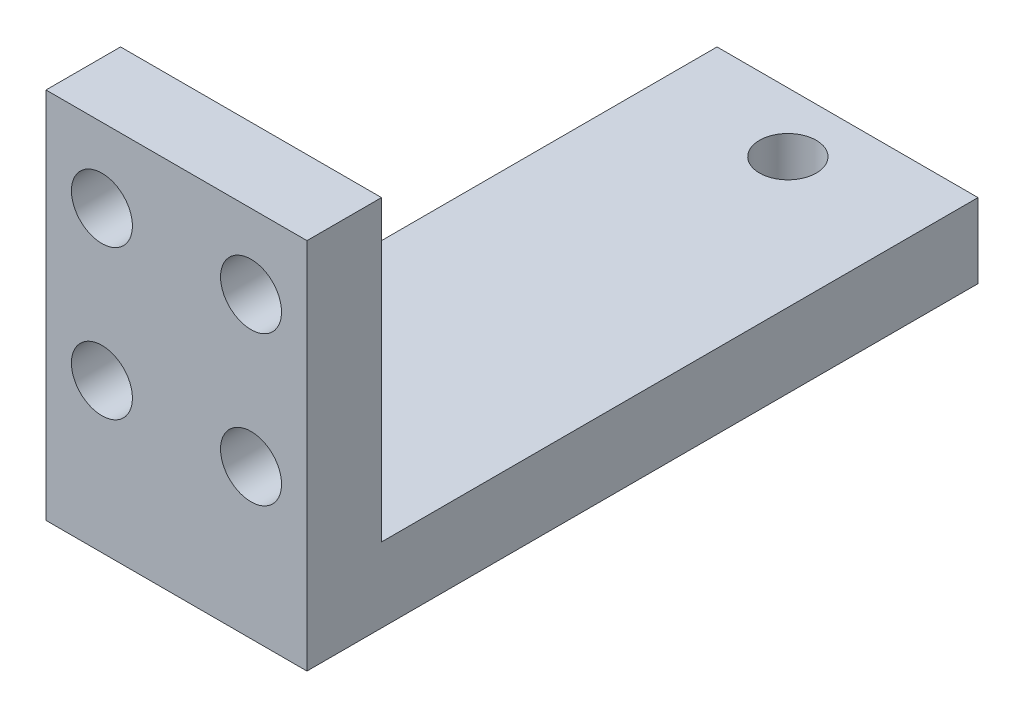
ISO-10303-21;
HEADER;
FILE_DESCRIPTION(('STEP AP214'),'2;1');
FILE_NAME('part.step','',(''),(''),'','','');
FILE_SCHEMA(('AUTOMOTIVE_DESIGN { 1 0 10303 214 1 1 1 1 }'));
ENDSEC;
DATA;
#1=APPLICATION_CONTEXT('core data for automotive mechanical design processes');
#2=APPLICATION_PROTOCOL_DEFINITION('international standard','automotive_design',2000,#1);
#3=PRODUCT_CONTEXT('',#1,'mechanical');
#4=PRODUCT('Part','Part','',(#3));
#5=PRODUCT_RELATED_PRODUCT_CATEGORY('part','',(#4));
#6=PRODUCT_DEFINITION_FORMATION('','',#4);
#7=PRODUCT_DEFINITION_CONTEXT('part definition',#1,'design');
#8=PRODUCT_DEFINITION('design','',#6,#7);
#9=PRODUCT_DEFINITION_SHAPE('','',#8);
#10=(LENGTH_UNIT() NAMED_UNIT(*) SI_UNIT(.MILLI.,.METRE.));
#11=(NAMED_UNIT(*) PLANE_ANGLE_UNIT() SI_UNIT($,.RADIAN.));
#12=(NAMED_UNIT(*) SI_UNIT($,.STERADIAN.) SOLID_ANGLE_UNIT());
#13=UNCERTAINTY_MEASURE_WITH_UNIT(LENGTH_MEASURE(1.E-05),#10,'distance_accuracy_value','');
#14=(GEOMETRIC_REPRESENTATION_CONTEXT(3) GLOBAL_UNCERTAINTY_ASSIGNED_CONTEXT((#13)) GLOBAL_UNIT_ASSIGNED_CONTEXT((#10,
#11,#12)) REPRESENTATION_CONTEXT('',''));
#15=CARTESIAN_POINT('',(0.,0.,0.));
#16=DIRECTION('',(0.,0.,1.));
#17=DIRECTION('',(1.,0.,0.));
#18=AXIS2_PLACEMENT_3D('',#15,#16,#17);
#19=CARTESIAN_POINT('',(0.,10.,0.));
#20=DIRECTION('',(0.,-1.,0.));
#21=DIRECTION('',(0.,0.,-1.));
#22=AXIS2_PLACEMENT_3D('',#19,#20,#21);
#23=PLANE('',#22);
#24=CARTESIAN_POINT('',(17.5,10.,-82.));
#25=DIRECTION('',(0.,1.,0.));
#26=DIRECTION('',(0.,0.,1.));
#27=AXIS2_PLACEMENT_3D('',#24,#25,#26);
#28=CIRCLE('',#27,3.81);
#29=CARTESIAN_POINT('',(17.5,10.,-78.19));
#30=VERTEX_POINT('',#29);
#31=EDGE_CURVE('E172',#30,#30,#28,.T.);
#32=ORIENTED_EDGE('',*,*,#31,.F.);
#33=EDGE_LOOP('',(#32));
#34=FACE_BOUND('',#33,.T.);
#35=DIRECTION('',(-1.,0.,0.));
#36=VECTOR('',#35,1.);
#37=CARTESIAN_POINT('',(0.,10.,-10.));
#38=LINE('',#37,#36);
#39=CARTESIAN_POINT('',(35.,10.,-10.));
#40=VERTEX_POINT('',#39);
#41=CARTESIAN_POINT('',(0.,10.,-10.));
#42=VERTEX_POINT('',#41);
#43=EDGE_CURVE('E53',#40,#42,#38,.T.);
#44=ORIENTED_EDGE('',*,*,#43,.F.);
#45=DIRECTION('',(0.,0.,-1.));
#46=VECTOR('',#45,1.);
#47=CARTESIAN_POINT('',(35.,10.,0.));
#48=LINE('',#47,#46);
#49=CARTESIAN_POINT('',(35.,10.,-90.));
#50=VERTEX_POINT('',#49);
#51=EDGE_CURVE('E138',#40,#50,#48,.T.);
#52=ORIENTED_EDGE('',*,*,#51,.T.);
#53=DIRECTION('',(-1.,0.,0.));
#54=VECTOR('',#53,1.);
#55=CARTESIAN_POINT('',(0.,10.,-90.));
#56=LINE('',#55,#54);
#57=CARTESIAN_POINT('',(0.,10.,-90.));
#58=VERTEX_POINT('',#57);
#59=EDGE_CURVE('E59',#50,#58,#56,.T.);
#60=ORIENTED_EDGE('',*,*,#59,.T.);
#61=DIRECTION('',(0.,0.,1.));
#62=VECTOR('',#61,1.);
#63=CARTESIAN_POINT('',(0.,10.,0.));
#64=LINE('',#63,#62);
#65=EDGE_CURVE('E88',#58,#42,#64,.T.);
#66=ORIENTED_EDGE('',*,*,#65,.T.);
#67=EDGE_LOOP('',(#44,#52,#60,#66));
#68=FACE_BOUND('',#67,.T.);
#69=ADVANCED_FACE('F36',(#34,#68),#23,.F.);
#70=CARTESIAN_POINT('',(0.,10.,0.));
#71=DIRECTION('',(1.,0.,0.));
#72=DIRECTION('',(0.,0.,-1.));
#73=AXIS2_PLACEMENT_3D('',#70,#71,#72);
#74=PLANE('',#73);
#75=DIRECTION('',(0.,0.,1.));
#76=VECTOR('',#75,1.);
#77=CARTESIAN_POINT('',(0.,0.,0.));
#78=LINE('',#77,#76);
#79=CARTESIAN_POINT('',(0.,0.,-90.));
#80=VERTEX_POINT('',#79);
#81=CARTESIAN_POINT('',(0.,0.,0.));
#82=VERTEX_POINT('',#81);
#83=EDGE_CURVE('E94',#80,#82,#78,.T.);
#84=ORIENTED_EDGE('',*,*,#83,.T.);
#85=DIRECTION('',(0.,-1.,0.));
#86=VECTOR('',#85,1.);
#87=CARTESIAN_POINT('',(0.,10.,0.));
#88=LINE('',#87,#86);
#89=CARTESIAN_POINT('',(0.,50.,0.));
#90=VERTEX_POINT('',#89);
#91=EDGE_CURVE('E11',#90,#82,#88,.T.);
#92=ORIENTED_EDGE('',*,*,#91,.F.);
#93=DIRECTION('',(0.,0.,1.));
#94=VECTOR('',#93,1.);
#95=CARTESIAN_POINT('',(0.,50.,0.));
#96=LINE('',#95,#94);
#97=CARTESIAN_POINT('',(0.,50.,-10.));
#98=VERTEX_POINT('',#97);
#99=EDGE_CURVE('E125',#98,#90,#96,.T.);
#100=ORIENTED_EDGE('',*,*,#99,.F.);
#101=DIRECTION('',(0.,-1.,0.));
#102=VECTOR('',#101,1.);
#103=CARTESIAN_POINT('',(0.,50.,-10.));
#104=LINE('',#103,#102);
#105=EDGE_CURVE('E103',#98,#42,#104,.T.);
#106=ORIENTED_EDGE('',*,*,#105,.T.);
#107=ORIENTED_EDGE('',*,*,#65,.F.);
#108=DIRECTION('',(0.,-1.,0.));
#109=VECTOR('',#108,1.);
#110=CARTESIAN_POINT('',(0.,10.,-90.));
#111=LINE('',#110,#109);
#112=EDGE_CURVE('E81',#58,#80,#111,.T.);
#113=ORIENTED_EDGE('',*,*,#112,.T.);
#114=EDGE_LOOP('',(#84,#92,#100,#106,#107,#113));
#115=FACE_BOUND('',#114,.T.);
#116=ADVANCED_FACE('F38',(#115),#74,.F.);
#117=CARTESIAN_POINT('',(0.,10.,0.));
#118=DIRECTION('',(0.,0.,-1.));
#119=DIRECTION('',(-1.,0.,0.));
#120=AXIS2_PLACEMENT_3D('',#117,#118,#119);
#121=PLANE('',#120);
#122=CARTESIAN_POINT('',(27.5,20.,0.));
#123=DIRECTION('',(0.,0.,-1.));
#124=DIRECTION('',(-1.,0.,0.));
#125=AXIS2_PLACEMENT_3D('',#122,#123,#124);
#126=CIRCLE('',#125,4.09068430141681);
#127=CARTESIAN_POINT('',(23.4093156985832,20.,0.));
#128=VERTEX_POINT('',#127);
#129=EDGE_CURVE('E163',#128,#128,#126,.T.);
#130=ORIENTED_EDGE('',*,*,#129,.T.);
#131=EDGE_LOOP('',(#130));
#132=FACE_BOUND('',#131,.T.);
#133=CARTESIAN_POINT('',(7.5,20.,0.));
#134=DIRECTION('',(0.,0.,-1.));
#135=DIRECTION('',(-1.,0.,0.));
#136=AXIS2_PLACEMENT_3D('',#133,#134,#135);
#137=CIRCLE('',#136,4.09068430141681);
#138=CARTESIAN_POINT('',(3.40931569858319,20.,0.));
#139=VERTEX_POINT('',#138);
#140=EDGE_CURVE('E166',#139,#139,#137,.T.);
#141=ORIENTED_EDGE('',*,*,#140,.T.);
#142=EDGE_LOOP('',(#141));
#143=FACE_BOUND('',#142,.T.);
#144=CARTESIAN_POINT('',(7.5,40.,0.));
#145=DIRECTION('',(0.,0.,-1.));
#146=DIRECTION('',(-1.,0.,0.));
#147=AXIS2_PLACEMENT_3D('',#144,#145,#146);
#148=CIRCLE('',#147,4.09068430141682);
#149=CARTESIAN_POINT('',(3.40931569858318,40.,0.));
#150=VERTEX_POINT('',#149);
#151=EDGE_CURVE('E162',#150,#150,#148,.T.);
#152=ORIENTED_EDGE('',*,*,#151,.T.);
#153=EDGE_LOOP('',(#152));
#154=FACE_BOUND('',#153,.T.);
#155=CARTESIAN_POINT('',(27.5,40.,0.));
#156=DIRECTION('',(0.,0.,-1.));
#157=DIRECTION('',(-1.,0.,0.));
#158=AXIS2_PLACEMENT_3D('',#155,#156,#157);
#159=CIRCLE('',#158,4.09068430141682);
#160=CARTESIAN_POINT('',(23.4093156985832,40.,0.));
#161=VERTEX_POINT('',#160);
#162=EDGE_CURVE('E116',#161,#161,#159,.T.);
#163=ORIENTED_EDGE('',*,*,#162,.T.);
#164=EDGE_LOOP('',(#163));
#165=FACE_BOUND('',#164,.T.);
#166=DIRECTION('',(1.,0.,0.));
#167=VECTOR('',#166,1.);
#168=CARTESIAN_POINT('',(0.,0.,0.));
#169=LINE('',#168,#167);
#170=CARTESIAN_POINT('',(35.,0.,0.));
#171=VERTEX_POINT('',#170);
#172=EDGE_CURVE('E98',#82,#171,#169,.T.);
#173=ORIENTED_EDGE('',*,*,#172,.T.);
#174=DIRECTION('',(0.,-1.,0.));
#175=VECTOR('',#174,1.);
#176=CARTESIAN_POINT('',(35.,10.,0.));
#177=LINE('',#176,#175);
#178=CARTESIAN_POINT('',(35.,50.,0.));
#179=VERTEX_POINT('',#178);
#180=EDGE_CURVE('E45',#179,#171,#177,.T.);
#181=ORIENTED_EDGE('',*,*,#180,.F.);
#182=DIRECTION('',(1.,0.,0.));
#183=VECTOR('',#182,1.);
#184=CARTESIAN_POINT('',(0.,50.,0.));
#185=LINE('',#184,#183);
#186=EDGE_CURVE('E131',#90,#179,#185,.T.);
#187=ORIENTED_EDGE('',*,*,#186,.F.);
#188=ORIENTED_EDGE('',*,*,#91,.T.);
#189=EDGE_LOOP('',(#173,#181,#187,#188));
#190=FACE_BOUND('',#189,.T.);
#191=ADVANCED_FACE('F150',(#132,#143,#154,#165,#190),#121,.F.);
#192=CARTESIAN_POINT('',(35.,10.,0.));
#193=DIRECTION('',(-1.,0.,0.));
#194=DIRECTION('',(0.,0.,1.));
#195=AXIS2_PLACEMENT_3D('',#192,#193,#194);
#196=PLANE('',#195);
#197=DIRECTION('',(0.,0.,-1.));
#198=VECTOR('',#197,1.);
#199=CARTESIAN_POINT('',(35.,0.,0.));
#200=LINE('',#199,#198);
#201=CARTESIAN_POINT('',(35.,0.,-90.));
#202=VERTEX_POINT('',#201);
#203=EDGE_CURVE('E89',#171,#202,#200,.T.);
#204=ORIENTED_EDGE('',*,*,#203,.T.);
#205=DIRECTION('',(0.,-1.,0.));
#206=VECTOR('',#205,1.);
#207=CARTESIAN_POINT('',(35.,10.,-90.));
#208=LINE('',#207,#206);
#209=EDGE_CURVE('E84',#50,#202,#208,.T.);
#210=ORIENTED_EDGE('',*,*,#209,.F.);
#211=ORIENTED_EDGE('',*,*,#51,.F.);
#212=DIRECTION('',(0.,-1.,0.));
#213=VECTOR('',#212,1.);
#214=CARTESIAN_POINT('',(35.,50.,-10.));
#215=LINE('',#214,#213);
#216=CARTESIAN_POINT('',(35.,50.,-10.));
#217=VERTEX_POINT('',#216);
#218=EDGE_CURVE('E99',#217,#40,#215,.T.);
#219=ORIENTED_EDGE('',*,*,#218,.F.);
#220=DIRECTION('',(0.,0.,-1.));
#221=VECTOR('',#220,1.);
#222=CARTESIAN_POINT('',(35.,50.,0.));
#223=LINE('',#222,#221);
#224=EDGE_CURVE('E146',#179,#217,#223,.T.);
#225=ORIENTED_EDGE('',*,*,#224,.F.);
#226=ORIENTED_EDGE('',*,*,#180,.T.);
#227=EDGE_LOOP('',(#204,#210,#211,#219,#225,#226));
#228=FACE_BOUND('',#227,.T.);
#229=ADVANCED_FACE('F141',(#228),#196,.F.);
#230=CARTESIAN_POINT('',(0.,10.,-90.));
#231=DIRECTION('',(0.,0.,1.));
#232=DIRECTION('',(1.,0.,0.));
#233=AXIS2_PLACEMENT_3D('',#230,#231,#232);
#234=PLANE('',#233);
#235=DIRECTION('',(-1.,0.,0.));
#236=VECTOR('',#235,1.);
#237=CARTESIAN_POINT('',(0.,0.,-90.));
#238=LINE('',#237,#236);
#239=EDGE_CURVE('E78',#202,#80,#238,.T.);
#240=ORIENTED_EDGE('',*,*,#239,.T.);
#241=ORIENTED_EDGE('',*,*,#112,.F.);
#242=ORIENTED_EDGE('',*,*,#59,.F.);
#243=ORIENTED_EDGE('',*,*,#209,.T.);
#244=EDGE_LOOP('',(#240,#241,#242,#243));
#245=FACE_BOUND('',#244,.T.);
#246=ADVANCED_FACE('F80',(#245),#234,.F.);
#247=CARTESIAN_POINT('',(0.,0.,0.));
#248=DIRECTION('',(0.,-1.,0.));
#249=DIRECTION('',(0.,0.,-1.));
#250=AXIS2_PLACEMENT_3D('',#247,#248,#249);
#251=PLANE('',#250);
#252=CARTESIAN_POINT('',(17.5,0.,-82.));
#253=DIRECTION('',(0.,1.,0.));
#254=DIRECTION('',(0.,0.,1.));
#255=AXIS2_PLACEMENT_3D('',#252,#253,#254);
#256=CIRCLE('',#255,3.81);
#257=CARTESIAN_POINT('',(17.5,0.,-78.19));
#258=VERTEX_POINT('',#257);
#259=EDGE_CURVE('E167',#258,#258,#256,.T.);
#260=ORIENTED_EDGE('',*,*,#259,.T.);
#261=EDGE_LOOP('',(#260));
#262=FACE_BOUND('',#261,.T.);
#263=ORIENTED_EDGE('',*,*,#83,.F.);
#264=ORIENTED_EDGE('',*,*,#239,.F.);
#265=ORIENTED_EDGE('',*,*,#203,.F.);
#266=ORIENTED_EDGE('',*,*,#172,.F.);
#267=EDGE_LOOP('',(#263,#264,#265,#266));
#268=FACE_BOUND('',#267,.T.);
#269=ADVANCED_FACE('F97',(#262,#268),#251,.T.);
#270=CARTESIAN_POINT('',(0.,50.,-10.));
#271=DIRECTION('',(0.,0.,1.));
#272=DIRECTION('',(1.,0.,0.));
#273=AXIS2_PLACEMENT_3D('',#270,#271,#272);
#274=PLANE('',#273);
#275=CARTESIAN_POINT('',(27.5,20.,-10.));
#276=DIRECTION('',(0.,0.,1.));
#277=DIRECTION('',(1.,0.,0.));
#278=AXIS2_PLACEMENT_3D('',#275,#276,#277);
#279=CIRCLE('',#278,4.09068430141681);
#280=CARTESIAN_POINT('',(31.5906843014168,20.,-10.));
#281=VERTEX_POINT('',#280);
#282=EDGE_CURVE('E40',#281,#281,#279,.T.);
#283=ORIENTED_EDGE('',*,*,#282,.T.);
#284=EDGE_LOOP('',(#283));
#285=FACE_BOUND('',#284,.T.);
#286=CARTESIAN_POINT('',(7.5,20.,-10.));
#287=DIRECTION('',(0.,0.,1.));
#288=DIRECTION('',(1.,0.,0.));
#289=AXIS2_PLACEMENT_3D('',#286,#287,#288);
#290=CIRCLE('',#289,4.09068430141681);
#291=CARTESIAN_POINT('',(11.5906843014168,20.,-10.));
#292=VERTEX_POINT('',#291);
#293=EDGE_CURVE('E118',#292,#292,#290,.T.);
#294=ORIENTED_EDGE('',*,*,#293,.T.);
#295=EDGE_LOOP('',(#294));
#296=FACE_BOUND('',#295,.T.);
#297=CARTESIAN_POINT('',(7.5,40.,-10.));
#298=DIRECTION('',(0.,0.,1.));
#299=DIRECTION('',(1.,0.,0.));
#300=AXIS2_PLACEMENT_3D('',#297,#298,#299);
#301=CIRCLE('',#300,4.09068430141682);
#302=CARTESIAN_POINT('',(11.5906843014168,40.,-10.));
#303=VERTEX_POINT('',#302);
#304=EDGE_CURVE('E115',#303,#303,#301,.T.);
#305=ORIENTED_EDGE('',*,*,#304,.T.);
#306=EDGE_LOOP('',(#305));
#307=FACE_BOUND('',#306,.T.);
#308=CARTESIAN_POINT('',(27.5,40.,-10.));
#309=DIRECTION('',(0.,0.,1.));
#310=DIRECTION('',(1.,0.,0.));
#311=AXIS2_PLACEMENT_3D('',#308,#309,#310);
#312=CIRCLE('',#311,4.09068430141682);
#313=CARTESIAN_POINT('',(31.5906843014168,40.,-10.));
#314=VERTEX_POINT('',#313);
#315=EDGE_CURVE('E112',#314,#314,#312,.T.);
#316=ORIENTED_EDGE('',*,*,#315,.T.);
#317=EDGE_LOOP('',(#316));
#318=FACE_BOUND('',#317,.T.);
#319=ORIENTED_EDGE('',*,*,#43,.T.);
#320=ORIENTED_EDGE('',*,*,#105,.F.);
#321=DIRECTION('',(-1.,0.,0.));
#322=VECTOR('',#321,1.);
#323=CARTESIAN_POINT('',(0.,50.,-10.));
#324=LINE('',#323,#322);
#325=EDGE_CURVE('E135',#217,#98,#324,.T.);
#326=ORIENTED_EDGE('',*,*,#325,.F.);
#327=ORIENTED_EDGE('',*,*,#218,.T.);
#328=EDGE_LOOP('',(#319,#320,#326,#327));
#329=FACE_BOUND('',#328,.T.);
#330=ADVANCED_FACE('F193',(#285,#296,#307,#318,#329),#274,.F.);
#331=CARTESIAN_POINT('',(0.,50.,0.));
#332=DIRECTION('',(0.,-1.,0.));
#333=DIRECTION('',(0.,0.,-1.));
#334=AXIS2_PLACEMENT_3D('',#331,#332,#333);
#335=PLANE('',#334);
#336=ORIENTED_EDGE('',*,*,#99,.T.);
#337=ORIENTED_EDGE('',*,*,#186,.T.);
#338=ORIENTED_EDGE('',*,*,#224,.T.);
#339=ORIENTED_EDGE('',*,*,#325,.T.);
#340=EDGE_LOOP('',(#336,#337,#338,#339));
#341=FACE_BOUND('',#340,.T.);
#342=ADVANCED_FACE('F155',(#341),#335,.F.);
#343=CARTESIAN_POINT('',(27.5,40.,0.));
#344=DIRECTION('',(0.,0.,-1.));
#345=DIRECTION('',(-1.,0.,0.));
#346=AXIS2_PLACEMENT_3D('',#343,#344,#345);
#347=CYLINDRICAL_SURFACE('',#346,4.09068430141682);
#348=ORIENTED_EDGE('',*,*,#162,.F.);
#349=EDGE_LOOP('',(#348));
#350=FACE_BOUND('',#349,.T.);
#351=ORIENTED_EDGE('',*,*,#315,.F.);
#352=EDGE_LOOP('',(#351));
#353=FACE_BOUND('',#352,.T.);
#354=ADVANCED_FACE('F212',(#350,#353),#347,.F.);
#355=CARTESIAN_POINT('',(7.5,40.,0.));
#356=DIRECTION('',(0.,0.,-1.));
#357=DIRECTION('',(-1.,0.,0.));
#358=AXIS2_PLACEMENT_3D('',#355,#356,#357);
#359=CYLINDRICAL_SURFACE('',#358,4.09068430141682);
#360=ORIENTED_EDGE('',*,*,#151,.F.);
#361=EDGE_LOOP('',(#360));
#362=FACE_BOUND('',#361,.T.);
#363=ORIENTED_EDGE('',*,*,#304,.F.);
#364=EDGE_LOOP('',(#363));
#365=FACE_BOUND('',#364,.T.);
#366=ADVANCED_FACE('F215',(#362,#365),#359,.F.);
#367=CARTESIAN_POINT('',(7.5,20.,0.));
#368=DIRECTION('',(0.,0.,-1.));
#369=DIRECTION('',(-1.,0.,0.));
#370=AXIS2_PLACEMENT_3D('',#367,#368,#369);
#371=CYLINDRICAL_SURFACE('',#370,4.09068430141681);
#372=ORIENTED_EDGE('',*,*,#140,.F.);
#373=EDGE_LOOP('',(#372));
#374=FACE_BOUND('',#373,.T.);
#375=ORIENTED_EDGE('',*,*,#293,.F.);
#376=EDGE_LOOP('',(#375));
#377=FACE_BOUND('',#376,.T.);
#378=ADVANCED_FACE('F227',(#374,#377),#371,.F.);
#379=CARTESIAN_POINT('',(27.5,20.,0.));
#380=DIRECTION('',(0.,0.,-1.));
#381=DIRECTION('',(-1.,0.,0.));
#382=AXIS2_PLACEMENT_3D('',#379,#380,#381);
#383=CYLINDRICAL_SURFACE('',#382,4.09068430141681);
#384=ORIENTED_EDGE('',*,*,#129,.F.);
#385=EDGE_LOOP('',(#384));
#386=FACE_BOUND('',#385,.T.);
#387=ORIENTED_EDGE('',*,*,#282,.F.);
#388=EDGE_LOOP('',(#387));
#389=FACE_BOUND('',#388,.T.);
#390=ADVANCED_FACE('F182',(#386,#389),#383,.F.);
#391=CARTESIAN_POINT('',(17.5,0.,-82.));
#392=DIRECTION('',(0.,1.,0.));
#393=DIRECTION('',(0.,0.,1.));
#394=AXIS2_PLACEMENT_3D('',#391,#392,#393);
#395=CYLINDRICAL_SURFACE('',#394,3.81);
#396=ORIENTED_EDGE('',*,*,#259,.F.);
#397=EDGE_LOOP('',(#396));
#398=FACE_BOUND('',#397,.T.);
#399=ORIENTED_EDGE('',*,*,#31,.T.);
#400=EDGE_LOOP('',(#399));
#401=FACE_BOUND('',#400,.T.);
#402=ADVANCED_FACE('F179',(#398,#401),#395,.F.);
#403=CLOSED_SHELL('',(#69,#116,#191,#229,#246,#269,#330,#342,#354,#366,#378,#390,#402));
#404=MANIFOLD_SOLID_BREP('B2',#403);
#405=ADVANCED_BREP_SHAPE_REPRESENTATION('',(#18,#404),#14);
#406=SHAPE_DEFINITION_REPRESENTATION(#9,#405);
ENDSEC;
END-ISO-10303-21;
